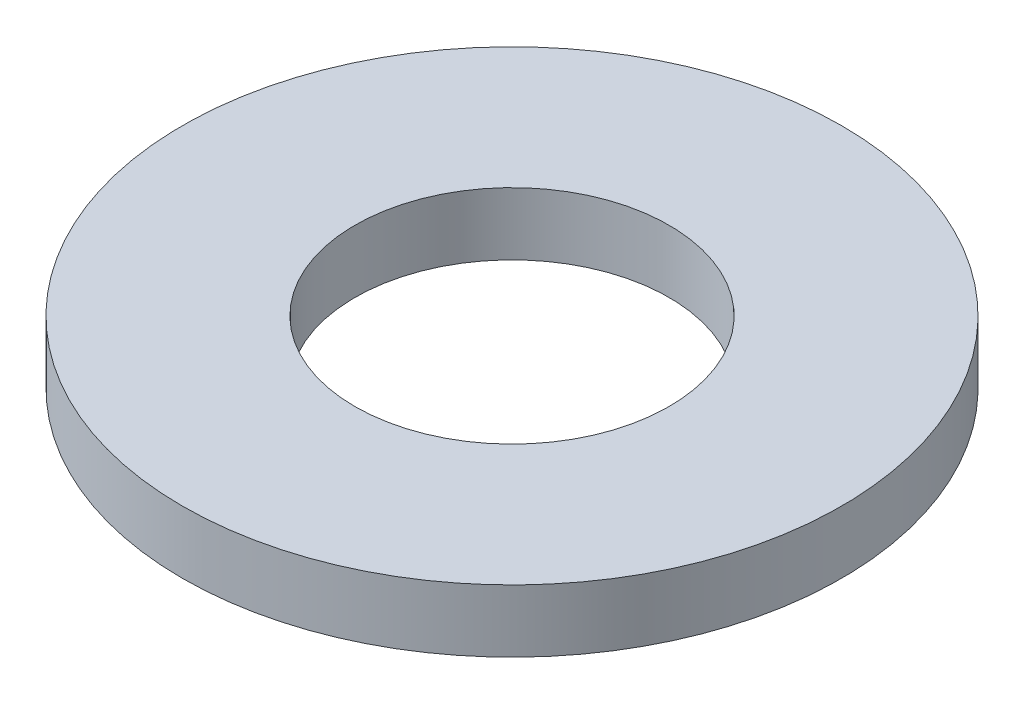
ISO-10303-21;
HEADER;
FILE_DESCRIPTION(('STEP AP214'),'2;1');
FILE_NAME('part.step','',(''),(''),'','','');
FILE_SCHEMA(('AUTOMOTIVE_DESIGN { 1 0 10303 214 1 1 1 1 }'));
ENDSEC;
DATA;
#1=APPLICATION_CONTEXT('core data for automotive mechanical design processes');
#2=APPLICATION_PROTOCOL_DEFINITION('international standard','automotive_design',2000,#1);
#3=PRODUCT_CONTEXT('',#1,'mechanical');
#4=PRODUCT('Part','Part','',(#3));
#5=PRODUCT_RELATED_PRODUCT_CATEGORY('part','',(#4));
#6=PRODUCT_DEFINITION_FORMATION('','',#4);
#7=PRODUCT_DEFINITION_CONTEXT('part definition',#1,'design');
#8=PRODUCT_DEFINITION('design','',#6,#7);
#9=PRODUCT_DEFINITION_SHAPE('','',#8);
#10=(LENGTH_UNIT() NAMED_UNIT(*) SI_UNIT(.MILLI.,.METRE.));
#11=(NAMED_UNIT(*) PLANE_ANGLE_UNIT() SI_UNIT($,.RADIAN.));
#12=(NAMED_UNIT(*) SI_UNIT($,.STERADIAN.) SOLID_ANGLE_UNIT());
#13=UNCERTAINTY_MEASURE_WITH_UNIT(LENGTH_MEASURE(1.E-05),#10,'distance_accuracy_value','');
#14=(GEOMETRIC_REPRESENTATION_CONTEXT(3) GLOBAL_UNCERTAINTY_ASSIGNED_CONTEXT((#13)) GLOBAL_UNIT_ASSIGNED_CONTEXT((#10,
#11,#12)) REPRESENTATION_CONTEXT('',''));
#15=CARTESIAN_POINT('',(0.,0.,0.));
#16=DIRECTION('',(0.,0.,1.));
#17=DIRECTION('',(1.,0.,0.));
#18=AXIS2_PLACEMENT_3D('',#15,#16,#17);
#19=CARTESIAN_POINT('',(0.,1.016,0.));
#20=DIRECTION('',(0.,1.,0.));
#21=DIRECTION('',(0.,0.,1.));
#22=AXIS2_PLACEMENT_3D('',#19,#20,#21);
#23=PLANE('',#22);
#24=CARTESIAN_POINT('',(0.,1.016,0.));
#25=DIRECTION('',(0.,1.,0.));
#26=DIRECTION('',(0.,0.,1.));
#27=AXIS2_PLACEMENT_3D('',#24,#25,#26);
#28=CIRCLE('',#27,5.35);
#29=CARTESIAN_POINT('',(0.,1.016,5.35));
#30=VERTEX_POINT('',#29);
#31=EDGE_CURVE('E10',#30,#30,#28,.T.);
#32=ORIENTED_EDGE('',*,*,#31,.T.);
#33=EDGE_LOOP('',(#32));
#34=FACE_BOUND('',#33,.T.);
#35=CARTESIAN_POINT('',(0.,1.016,0.));
#36=DIRECTION('',(0.,1.,0.));
#37=DIRECTION('',(0.,0.,1.));
#38=AXIS2_PLACEMENT_3D('',#35,#36,#37);
#39=CIRCLE('',#38,2.55);
#40=CARTESIAN_POINT('',(0.,1.016,2.55));
#41=VERTEX_POINT('',#40);
#42=EDGE_CURVE('E50',#41,#41,#39,.T.);
#43=ORIENTED_EDGE('',*,*,#42,.F.);
#44=EDGE_LOOP('',(#43));
#45=FACE_BOUND('',#44,.T.);
#46=ADVANCED_FACE('F37',(#34,#45),#23,.T.);
#47=CARTESIAN_POINT('',(0.,0.,0.));
#48=DIRECTION('',(0.,1.,0.));
#49=DIRECTION('',(0.,0.,1.));
#50=AXIS2_PLACEMENT_3D('',#47,#48,#49);
#51=PLANE('',#50);
#52=CARTESIAN_POINT('',(0.,0.,0.));
#53=DIRECTION('',(0.,1.,0.));
#54=DIRECTION('',(0.,0.,1.));
#55=AXIS2_PLACEMENT_3D('',#52,#53,#54);
#56=CIRCLE('',#55,5.35);
#57=CARTESIAN_POINT('',(0.,0.,5.35));
#58=VERTEX_POINT('',#57);
#59=EDGE_CURVE('E41',#58,#58,#56,.T.);
#60=ORIENTED_EDGE('',*,*,#59,.F.);
#61=EDGE_LOOP('',(#60));
#62=FACE_BOUND('',#61,.T.);
#63=CARTESIAN_POINT('',(0.,0.,0.));
#64=DIRECTION('',(0.,1.,0.));
#65=DIRECTION('',(0.,0.,1.));
#66=AXIS2_PLACEMENT_3D('',#63,#64,#65);
#67=CIRCLE('',#66,2.55);
#68=CARTESIAN_POINT('',(0.,0.,2.55));
#69=VERTEX_POINT('',#68);
#70=EDGE_CURVE('E52',#69,#69,#67,.T.);
#71=ORIENTED_EDGE('',*,*,#70,.T.);
#72=EDGE_LOOP('',(#71));
#73=FACE_BOUND('',#72,.T.);
#74=ADVANCED_FACE('F64',(#62,#73),#51,.F.);
#75=CARTESIAN_POINT('',(0.,1.016,0.));
#76=DIRECTION('',(0.,-1.,0.));
#77=DIRECTION('',(0.,0.,-1.));
#78=AXIS2_PLACEMENT_3D('',#75,#76,#77);
#79=CYLINDRICAL_SURFACE('',#78,5.35);
#80=ORIENTED_EDGE('',*,*,#31,.F.);
#81=EDGE_LOOP('',(#80));
#82=FACE_BOUND('',#81,.T.);
#83=ORIENTED_EDGE('',*,*,#59,.T.);
#84=EDGE_LOOP('',(#83));
#85=FACE_BOUND('',#84,.T.);
#86=ADVANCED_FACE('F39',(#82,#85),#79,.T.);
#87=CARTESIAN_POINT('',(0.,1.016,0.));
#88=DIRECTION('',(0.,-1.,0.));
#89=DIRECTION('',(0.,0.,-1.));
#90=AXIS2_PLACEMENT_3D('',#87,#88,#89);
#91=CYLINDRICAL_SURFACE('',#90,2.55);
#92=ORIENTED_EDGE('',*,*,#42,.T.);
#93=EDGE_LOOP('',(#92));
#94=FACE_BOUND('',#93,.T.);
#95=ORIENTED_EDGE('',*,*,#70,.F.);
#96=EDGE_LOOP('',(#95));
#97=FACE_BOUND('',#96,.T.);
#98=ADVANCED_FACE('F60',(#94,#97),#91,.F.);
#99=CLOSED_SHELL('',(#46,#74,#86,#98));
#100=MANIFOLD_SOLID_BREP('B2',#99);
#101=ADVANCED_BREP_SHAPE_REPRESENTATION('',(#18,#100),#14);
#102=SHAPE_DEFINITION_REPRESENTATION(#9,#101);
ENDSEC;
END-ISO-10303-21;
